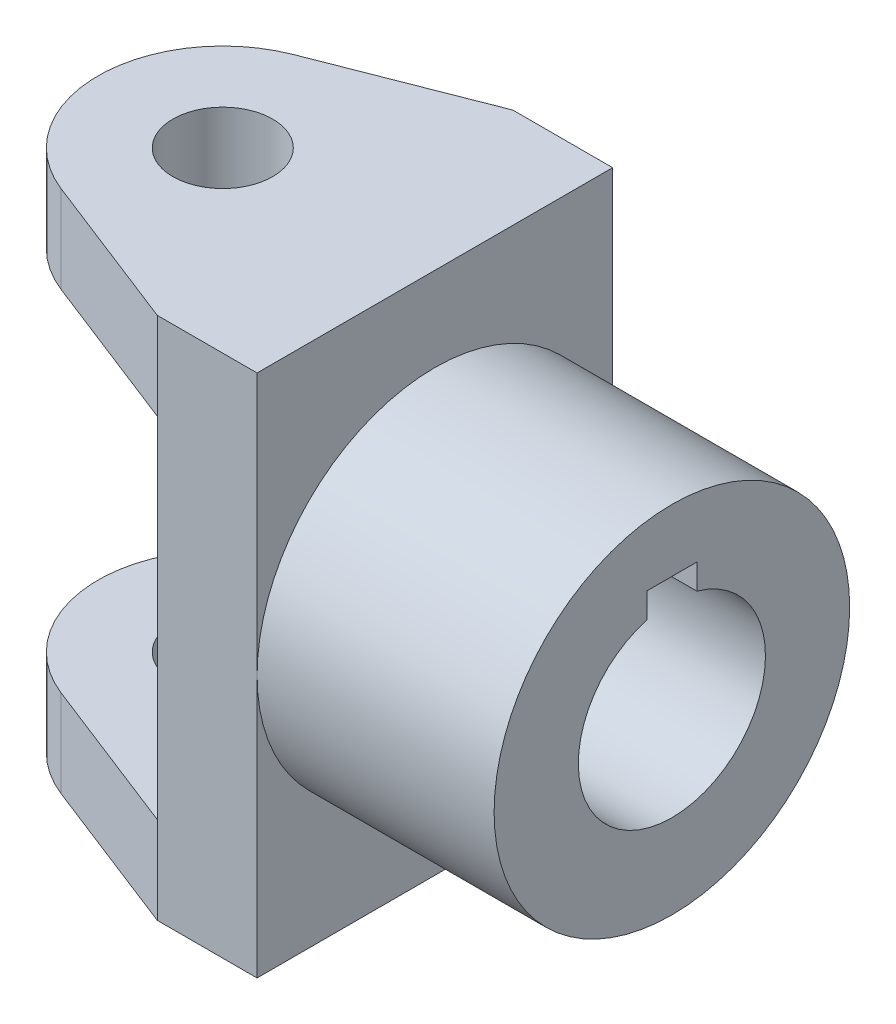
ISO-10303-21;
HEADER;
FILE_DESCRIPTION(('STEP AP214'),'2;1');
FILE_NAME('part.step','',(''),(''),'','','');
FILE_SCHEMA(('AUTOMOTIVE_DESIGN { 1 0 10303 214 1 1 1 1 }'));
ENDSEC;
DATA;
#1=APPLICATION_CONTEXT('core data for automotive mechanical design processes');
#2=APPLICATION_PROTOCOL_DEFINITION('international standard','automotive_design',2000,#1);
#3=PRODUCT_CONTEXT('',#1,'mechanical');
#4=PRODUCT('Part','Part','',(#3));
#5=PRODUCT_RELATED_PRODUCT_CATEGORY('part','',(#4));
#6=PRODUCT_DEFINITION_FORMATION('','',#4);
#7=PRODUCT_DEFINITION_CONTEXT('part definition',#1,'design');
#8=PRODUCT_DEFINITION('design','',#6,#7);
#9=PRODUCT_DEFINITION_SHAPE('','',#8);
#10=(LENGTH_UNIT() NAMED_UNIT(*) SI_UNIT(.MILLI.,.METRE.));
#11=(NAMED_UNIT(*) PLANE_ANGLE_UNIT() SI_UNIT($,.RADIAN.));
#12=(NAMED_UNIT(*) SI_UNIT($,.STERADIAN.) SOLID_ANGLE_UNIT());
#13=UNCERTAINTY_MEASURE_WITH_UNIT(LENGTH_MEASURE(1.E-05),#10,'distance_accuracy_value','');
#14=(GEOMETRIC_REPRESENTATION_CONTEXT(3) GLOBAL_UNCERTAINTY_ASSIGNED_CONTEXT((#13)) GLOBAL_UNIT_ASSIGNED_CONTEXT((#10,
#11,#12)) REPRESENTATION_CONTEXT('',''));
#15=CARTESIAN_POINT('',(0.,0.,0.));
#16=DIRECTION('',(0.,0.,1.));
#17=DIRECTION('',(1.,0.,0.));
#18=AXIS2_PLACEMENT_3D('',#15,#16,#17);
#19=CARTESIAN_POINT('',(-34.,-110.505474233816,0.));
#20=DIRECTION('',(0.,1.,0.));
#21=DIRECTION('',(0.,0.,1.));
#22=AXIS2_PLACEMENT_3D('',#19,#20,#21);
#23=CYLINDRICAL_SURFACE('',#22,8.);
#24=CARTESIAN_POINT('',(-34.,-42.,0.));
#25=DIRECTION('',(0.,1.,0.));
#26=DIRECTION('',(0.,0.,1.));
#27=AXIS2_PLACEMENT_3D('',#24,#25,#26);
#28=CIRCLE('',#27,8.);
#29=CARTESIAN_POINT('',(-34.,-42.,8.00000000000002));
#30=VERTEX_POINT('',#29);
#31=EDGE_CURVE('E223',#30,#30,#28,.F.);
#32=ORIENTED_EDGE('',*,*,#31,.T.);
#33=EDGE_LOOP('',(#32));
#34=FACE_BOUND('',#33,.T.);
#35=CARTESIAN_POINT('',(-34.,-28.,0.));
#36=DIRECTION('',(0.,1.,0.));
#37=DIRECTION('',(0.,0.,1.));
#38=AXIS2_PLACEMENT_3D('',#35,#36,#37);
#39=CIRCLE('',#38,8.);
#40=CARTESIAN_POINT('',(-34.,-28.,8.00000000000001));
#41=VERTEX_POINT('',#40);
#42=EDGE_CURVE('E211',#41,#41,#39,.F.);
#43=ORIENTED_EDGE('',*,*,#42,.F.);
#44=EDGE_LOOP('',(#43));
#45=FACE_BOUND('',#44,.T.);
#46=ADVANCED_FACE('F50',(#34,#45),#23,.F.);
#47=CARTESIAN_POINT('',(-11.773913756626,-110.505474233816,-30.150316819408));
#48=DIRECTION('',(-0.363755267255677,0.,-0.931494554757971));
#49=DIRECTION('',(-0.931494554757971,0.,0.363755267255677));
#50=AXIS2_PLACEMENT_3D('',#47,#48,#49);
#51=PLANE('',#50);
#52=DIRECTION('',(0.,1.,0.));
#53=VECTOR('',#52,1.);
#54=CARTESIAN_POINT('',(-41.2751053451135,-110.505474233816,-18.6298910951594));
#55=LINE('',#54,#53);
#56=CARTESIAN_POINT('',(-41.2751053451135,-42.,-18.6298910951594));
#57=VERTEX_POINT('',#56);
#58=CARTESIAN_POINT('',(-41.2751053451135,-28.,-18.6298910951594));
#59=VERTEX_POINT('',#58);
#60=EDGE_CURVE('E243',#57,#59,#55,.T.);
#61=ORIENTED_EDGE('',*,*,#60,.T.);
#62=DIRECTION('',(-0.931494554757971,0.,0.363755267255677));
#63=VECTOR('',#62,1.);
#64=CARTESIAN_POINT('',(-11.773913756626,-28.,-30.150316819408));
#65=LINE('',#64,#63);
#66=CARTESIAN_POINT('',(-16.,-28.,-28.5));
#67=VERTEX_POINT('',#66);
#68=EDGE_CURVE('E185',#67,#59,#65,.T.);
#69=ORIENTED_EDGE('',*,*,#68,.F.);
#70=DIRECTION('',(0.,-1.,0.));
#71=VECTOR('',#70,1.);
#72=CARTESIAN_POINT('',(-16.,-42.,-28.5));
#73=LINE('',#72,#71);
#74=CARTESIAN_POINT('',(-16.,-42.,-28.5));
#75=VERTEX_POINT('',#74);
#76=EDGE_CURVE('E252',#67,#75,#73,.T.);
#77=ORIENTED_EDGE('',*,*,#76,.T.);
#78=DIRECTION('',(0.931494554757971,0.,-0.363755267255677));
#79=VECTOR('',#78,1.);
#80=CARTESIAN_POINT('',(-11.773913756626,-42.,-30.150316819408));
#81=LINE('',#80,#79);
#82=EDGE_CURVE('E215',#57,#75,#81,.T.);
#83=ORIENTED_EDGE('',*,*,#82,.F.);
#84=EDGE_LOOP('',(#61,#69,#77,#83));
#85=FACE_BOUND('',#84,.T.);
#86=ADVANCED_FACE('F310',(#85),#51,.T.);
#87=CARTESIAN_POINT('',(-34.,-110.505474233816,0.));
#88=DIRECTION('',(0.,1.,0.));
#89=DIRECTION('',(0.,0.,1.));
#90=AXIS2_PLACEMENT_3D('',#87,#88,#89);
#91=CYLINDRICAL_SURFACE('',#90,20.);
#92=DIRECTION('',(0.,1.,0.));
#93=VECTOR('',#92,1.);
#94=CARTESIAN_POINT('',(-41.2751053451135,-110.505474233816,18.6298910951595));
#95=LINE('',#94,#93);
#96=CARTESIAN_POINT('',(-41.2751053451135,-42.,18.6298910951594));
#97=VERTEX_POINT('',#96);
#98=CARTESIAN_POINT('',(-41.2751053451135,-28.,18.6298910951594));
#99=VERTEX_POINT('',#98);
#100=EDGE_CURVE('E219',#97,#99,#95,.T.);
#101=ORIENTED_EDGE('',*,*,#100,.T.);
#102=CARTESIAN_POINT('',(-34.,-28.,0.));
#103=DIRECTION('',(0.,1.,0.));
#104=DIRECTION('',(0.,0.,1.));
#105=AXIS2_PLACEMENT_3D('',#102,#103,#104);
#106=CIRCLE('',#105,20.);
#107=EDGE_CURVE('E187',#59,#99,#106,.T.);
#108=ORIENTED_EDGE('',*,*,#107,.F.);
#109=ORIENTED_EDGE('',*,*,#60,.F.);
#110=CARTESIAN_POINT('',(-34.,-42.,0.));
#111=DIRECTION('',(0.,1.,0.));
#112=DIRECTION('',(0.,0.,1.));
#113=AXIS2_PLACEMENT_3D('',#110,#111,#112);
#114=CIRCLE('',#113,20.);
#115=EDGE_CURVE('E218',#97,#57,#114,.F.);
#116=ORIENTED_EDGE('',*,*,#115,.F.);
#117=EDGE_LOOP('',(#101,#108,#109,#116));
#118=FACE_BOUND('',#117,.T.);
#119=ADVANCED_FACE('F317',(#118),#91,.T.);
#120=CARTESIAN_POINT('',(-11.773913756626,-110.505474233816,30.150316819408));
#121=DIRECTION('',(-0.363755267255677,0.,0.931494554757971));
#122=DIRECTION('',(0.931494554757971,0.,0.363755267255677));
#123=AXIS2_PLACEMENT_3D('',#120,#121,#122);
#124=PLANE('',#123);
#125=DIRECTION('',(0.,1.,0.));
#126=VECTOR('',#125,1.);
#127=CARTESIAN_POINT('',(-16.,-42.,28.5));
#128=LINE('',#127,#126);
#129=CARTESIAN_POINT('',(-16.,-42.,28.5));
#130=VERTEX_POINT('',#129);
#131=CARTESIAN_POINT('',(-16.,-28.,28.5));
#132=VERTEX_POINT('',#131);
#133=EDGE_CURVE('E253',#130,#132,#128,.T.);
#134=ORIENTED_EDGE('',*,*,#133,.T.);
#135=DIRECTION('',(0.931494554757971,0.,0.363755267255677));
#136=VECTOR('',#135,1.);
#137=CARTESIAN_POINT('',(-11.773913756626,-28.,30.150316819408));
#138=LINE('',#137,#136);
#139=EDGE_CURVE('E189',#99,#132,#138,.T.);
#140=ORIENTED_EDGE('',*,*,#139,.F.);
#141=ORIENTED_EDGE('',*,*,#100,.F.);
#142=DIRECTION('',(-0.931494554757971,0.,-0.363755267255677));
#143=VECTOR('',#142,1.);
#144=CARTESIAN_POINT('',(-11.773913756626,-42.,30.150316819408));
#145=LINE('',#144,#143);
#146=EDGE_CURVE('E221',#130,#97,#145,.T.);
#147=ORIENTED_EDGE('',*,*,#146,.F.);
#148=EDGE_LOOP('',(#134,#140,#141,#147));
#149=FACE_BOUND('',#148,.T.);
#150=ADVANCED_FACE('F358',(#149),#124,.T.);
#151=CARTESIAN_POINT('',(38.,0.,0.));
#152=DIRECTION('',(1.,0.,0.));
#153=DIRECTION('',(0.,0.,-1.));
#154=AXIS2_PLACEMENT_3D('',#151,#152,#153);
#155=PLANE('',#154);
#156=DIRECTION('',(0.,1.,0.));
#157=VECTOR('',#156,1.);
#158=CARTESIAN_POINT('',(38.,18.5,-4.));
#159=LINE('',#158,#157);
#160=CARTESIAN_POINT('',(38.,14.456832294801,-4.));
#161=VERTEX_POINT('',#160);
#162=CARTESIAN_POINT('',(38.,18.5,-4.));
#163=VERTEX_POINT('',#162);
#164=EDGE_CURVE('E156',#161,#163,#159,.T.);
#165=ORIENTED_EDGE('',*,*,#164,.F.);
#166=CARTESIAN_POINT('',(38.,0.,0.));
#167=DIRECTION('',(1.,0.,0.));
#168=DIRECTION('',(0.,0.,-1.));
#169=AXIS2_PLACEMENT_3D('',#166,#167,#168);
#170=CIRCLE('',#169,15.);
#171=CARTESIAN_POINT('',(38.,14.456832294801,4.));
#172=VERTEX_POINT('',#171);
#173=EDGE_CURVE('E278',#172,#161,#170,.T.);
#174=ORIENTED_EDGE('',*,*,#173,.F.);
#175=DIRECTION('',(0.,-1.,0.));
#176=VECTOR('',#175,1.);
#177=CARTESIAN_POINT('',(38.,18.5,4.));
#178=LINE('',#177,#176);
#179=CARTESIAN_POINT('',(38.,18.5,4.));
#180=VERTEX_POINT('',#179);
#181=EDGE_CURVE('E173',#180,#172,#178,.T.);
#182=ORIENTED_EDGE('',*,*,#181,.F.);
#183=DIRECTION('',(0.,0.,1.));
#184=VECTOR('',#183,1.);
#185=CARTESIAN_POINT('',(38.,18.5,4.));
#186=LINE('',#185,#184);
#187=EDGE_CURVE('E167',#163,#180,#186,.T.);
#188=ORIENTED_EDGE('',*,*,#187,.F.);
#189=EDGE_LOOP('',(#165,#174,#182,#188));
#190=FACE_BOUND('',#189,.T.);
#191=CARTESIAN_POINT('',(38.,0.,0.));
#192=DIRECTION('',(1.,0.,0.));
#193=DIRECTION('',(0.,0.,-1.));
#194=AXIS2_PLACEMENT_3D('',#191,#192,#193);
#195=CIRCLE('',#194,28.5);
#196=CARTESIAN_POINT('',(38.,0.,-28.5));
#197=VERTEX_POINT('',#196);
#198=EDGE_CURVE('E281',#197,#197,#195,.T.);
#199=ORIENTED_EDGE('',*,*,#198,.T.);
#200=EDGE_LOOP('',(#199));
#201=FACE_BOUND('',#200,.T.);
#202=ADVANCED_FACE('F175',(#190,#201),#155,.T.);
#203=CARTESIAN_POINT('',(38.,0.,0.));
#204=DIRECTION('',(-1.,0.,0.));
#205=DIRECTION('',(0.,0.,1.));
#206=AXIS2_PLACEMENT_3D('',#203,#204,#205);
#207=CYLINDRICAL_SURFACE('',#206,28.5);
#208=ORIENTED_EDGE('',*,*,#198,.F.);
#209=EDGE_LOOP('',(#208));
#210=FACE_BOUND('',#209,.T.);
#211=CARTESIAN_POINT('',(0.,0.,0.));
#212=DIRECTION('',(1.,0.,0.));
#213=DIRECTION('',(0.,0.,-1.));
#214=AXIS2_PLACEMENT_3D('',#211,#212,#213);
#215=CIRCLE('',#214,28.5);
#216=CARTESIAN_POINT('',(0.,0.,-28.5));
#217=VERTEX_POINT('',#216);
#218=CARTESIAN_POINT('',(0.,0.,28.5));
#219=VERTEX_POINT('',#218);
#220=EDGE_CURVE('E284',#217,#219,#215,.T.);
#221=ORIENTED_EDGE('',*,*,#220,.T.);
#222=EDGE_CURVE('E280',#219,#217,#215,.T.);
#223=ORIENTED_EDGE('',*,*,#222,.T.);
#224=EDGE_LOOP('',(#221,#223));
#225=FACE_BOUND('',#224,.T.);
#226=ADVANCED_FACE('F52',(#210,#225),#207,.T.);
#227=CARTESIAN_POINT('',(38.,0.,0.));
#228=DIRECTION('',(-1.,0.,0.));
#229=DIRECTION('',(0.,0.,1.));
#230=AXIS2_PLACEMENT_3D('',#227,#228,#229);
#231=CYLINDRICAL_SURFACE('',#230,15.);
#232=DIRECTION('',(-1.,0.,0.));
#233=VECTOR('',#232,1.);
#234=CARTESIAN_POINT('',(38.,14.456832294801,-4.));
#235=LINE('',#234,#233);
#236=CARTESIAN_POINT('',(-16.,14.456832294801,-4.));
#237=VERTEX_POINT('',#236);
#238=EDGE_CURVE('E162',#237,#161,#235,.F.);
#239=ORIENTED_EDGE('',*,*,#238,.F.);
#240=CARTESIAN_POINT('',(-16.,0.,0.));
#241=DIRECTION('',(-1.,0.,0.));
#242=DIRECTION('',(0.,0.,1.));
#243=AXIS2_PLACEMENT_3D('',#240,#241,#242);
#244=CIRCLE('',#243,15.);
#245=CARTESIAN_POINT('',(-16.,14.456832294801,4.));
#246=VERTEX_POINT('',#245);
#247=EDGE_CURVE('E214',#237,#246,#244,.T.);
#248=ORIENTED_EDGE('',*,*,#247,.T.);
#249=DIRECTION('',(-1.,0.,0.));
#250=VECTOR('',#249,1.);
#251=CARTESIAN_POINT('',(38.,14.456832294801,4.));
#252=LINE('',#251,#250);
#253=EDGE_CURVE('E180',#172,#246,#252,.T.);
#254=ORIENTED_EDGE('',*,*,#253,.F.);
#255=ORIENTED_EDGE('',*,*,#173,.T.);
#256=EDGE_LOOP('',(#239,#248,#254,#255));
#257=FACE_BOUND('',#256,.T.);
#258=ADVANCED_FACE('F296',(#257),#231,.F.);
#259=CARTESIAN_POINT('',(0.,0.,0.));
#260=DIRECTION('',(-1.,0.,0.));
#261=DIRECTION('',(0.,0.,1.));
#262=AXIS2_PLACEMENT_3D('',#259,#260,#261);
#263=PLANE('',#262);
#264=ORIENTED_EDGE('',*,*,#220,.F.);
#265=DIRECTION('',(0.,-1.,0.));
#266=VECTOR('',#265,1.);
#267=CARTESIAN_POINT('',(0.,-42.,-28.5));
#268=LINE('',#267,#266);
#269=CARTESIAN_POINT('',(0.,42.,-28.5));
#270=VERTEX_POINT('',#269);
#271=EDGE_CURVE('E257',#270,#217,#268,.T.);
#272=ORIENTED_EDGE('',*,*,#271,.F.);
#273=DIRECTION('',(0.,0.,-1.));
#274=VECTOR('',#273,1.);
#275=CARTESIAN_POINT('',(0.,42.,28.5));
#276=LINE('',#275,#274);
#277=CARTESIAN_POINT('',(0.,42.,28.5));
#278=VERTEX_POINT('',#277);
#279=EDGE_CURVE('E265',#278,#270,#276,.T.);
#280=ORIENTED_EDGE('',*,*,#279,.F.);
#281=DIRECTION('',(0.,1.,0.));
#282=VECTOR('',#281,1.);
#283=CARTESIAN_POINT('',(0.,-42.,28.5));
#284=LINE('',#283,#282);
#285=EDGE_CURVE('E261',#219,#278,#284,.T.);
#286=ORIENTED_EDGE('',*,*,#285,.F.);
#287=EDGE_LOOP('',(#264,#272,#280,#286));
#288=FACE_BOUND('',#287,.T.);
#289=ADVANCED_FACE('F298',(#288),#263,.F.);
#290=ORIENTED_EDGE('',*,*,#222,.F.);
#291=CARTESIAN_POINT('',(0.,-42.,28.5));
#292=VERTEX_POINT('',#291);
#293=EDGE_CURVE('E262',#292,#219,#284,.T.);
#294=ORIENTED_EDGE('',*,*,#293,.F.);
#295=DIRECTION('',(0.,0.,1.));
#296=VECTOR('',#295,1.);
#297=CARTESIAN_POINT('',(0.,-42.,28.5));
#298=LINE('',#297,#296);
#299=CARTESIAN_POINT('',(0.,-42.,-28.5));
#300=VERTEX_POINT('',#299);
#301=EDGE_CURVE('E259',#300,#292,#298,.T.);
#302=ORIENTED_EDGE('',*,*,#301,.F.);
#303=EDGE_CURVE('E226',#217,#300,#268,.T.);
#304=ORIENTED_EDGE('',*,*,#303,.F.);
#305=EDGE_LOOP('',(#290,#294,#302,#304));
#306=FACE_BOUND('',#305,.T.);
#307=ADVANCED_FACE('F304',(#306),#263,.F.);
#308=CARTESIAN_POINT('',(-16.,-42.,-28.5));
#309=DIRECTION('',(0.,0.,1.));
#310=DIRECTION('',(1.,0.,0.));
#311=AXIS2_PLACEMENT_3D('',#308,#309,#310);
#312=PLANE('',#311);
#313=ORIENTED_EDGE('',*,*,#271,.T.);
#314=ORIENTED_EDGE('',*,*,#303,.T.);
#315=DIRECTION('',(1.,0.,0.));
#316=VECTOR('',#315,1.);
#317=CARTESIAN_POINT('',(-16.,-42.,-28.5));
#318=LINE('',#317,#316);
#319=EDGE_CURVE('E275',#75,#300,#318,.T.);
#320=ORIENTED_EDGE('',*,*,#319,.F.);
#321=ORIENTED_EDGE('',*,*,#76,.F.);
#322=DIRECTION('',(0.,1.,0.));
#323=VECTOR('',#322,1.);
#324=CARTESIAN_POINT('',(-16.,-28.,-28.5));
#325=LINE('',#324,#323);
#326=CARTESIAN_POINT('',(-16.,28.,-28.5));
#327=VERTEX_POINT('',#326);
#328=EDGE_CURVE('E204',#67,#327,#325,.T.);
#329=ORIENTED_EDGE('',*,*,#328,.T.);
#330=CARTESIAN_POINT('',(-16.,42.,-28.5));
#331=VERTEX_POINT('',#330);
#332=EDGE_CURVE('E248',#331,#327,#73,.T.);
#333=ORIENTED_EDGE('',*,*,#332,.F.);
#334=DIRECTION('',(1.,0.,0.));
#335=VECTOR('',#334,1.);
#336=CARTESIAN_POINT('',(-16.,42.,-28.5));
#337=LINE('',#336,#335);
#338=EDGE_CURVE('E256',#331,#270,#337,.T.);
#339=ORIENTED_EDGE('',*,*,#338,.T.);
#340=EDGE_LOOP('',(#313,#314,#320,#321,#329,#333,#339));
#341=FACE_BOUND('',#340,.T.);
#342=ADVANCED_FACE('F387',(#341),#312,.F.);
#343=CARTESIAN_POINT('',(-16.,-42.,28.5));
#344=DIRECTION('',(0.,1.,0.));
#345=DIRECTION('',(0.,0.,1.));
#346=AXIS2_PLACEMENT_3D('',#343,#344,#345);
#347=PLANE('',#346);
#348=ORIENTED_EDGE('',*,*,#301,.T.);
#349=DIRECTION('',(1.,0.,0.));
#350=VECTOR('',#349,1.);
#351=CARTESIAN_POINT('',(-16.,-42.,28.5));
#352=LINE('',#351,#350);
#353=EDGE_CURVE('E272',#130,#292,#352,.T.);
#354=ORIENTED_EDGE('',*,*,#353,.F.);
#355=ORIENTED_EDGE('',*,*,#146,.T.);
#356=ORIENTED_EDGE('',*,*,#115,.T.);
#357=ORIENTED_EDGE('',*,*,#82,.T.);
#358=ORIENTED_EDGE('',*,*,#319,.T.);
#359=EDGE_LOOP('',(#348,#354,#355,#356,#357,#358));
#360=FACE_BOUND('',#359,.T.);
#361=ORIENTED_EDGE('',*,*,#31,.F.);
#362=EDGE_LOOP('',(#361));
#363=FACE_BOUND('',#362,.T.);
#364=ADVANCED_FACE('F399',(#360,#363),#347,.F.);
#365=CARTESIAN_POINT('',(-16.,-42.,28.5));
#366=DIRECTION('',(0.,0.,-1.));
#367=DIRECTION('',(-1.,0.,0.));
#368=AXIS2_PLACEMENT_3D('',#365,#366,#367);
#369=PLANE('',#368);
#370=ORIENTED_EDGE('',*,*,#293,.T.);
#371=ORIENTED_EDGE('',*,*,#285,.T.);
#372=DIRECTION('',(1.,0.,0.));
#373=VECTOR('',#372,1.);
#374=CARTESIAN_POINT('',(-16.,42.,28.5));
#375=LINE('',#374,#373);
#376=CARTESIAN_POINT('',(-16.,42.,28.5));
#377=VERTEX_POINT('',#376);
#378=EDGE_CURVE('E269',#377,#278,#375,.T.);
#379=ORIENTED_EDGE('',*,*,#378,.F.);
#380=CARTESIAN_POINT('',(-16.,28.,28.5));
#381=VERTEX_POINT('',#380);
#382=EDGE_CURVE('E251',#381,#377,#128,.T.);
#383=ORIENTED_EDGE('',*,*,#382,.F.);
#384=DIRECTION('',(0.,1.,0.));
#385=VECTOR('',#384,1.);
#386=CARTESIAN_POINT('',(-16.,-28.,28.5));
#387=LINE('',#386,#385);
#388=EDGE_CURVE('E194',#132,#381,#387,.T.);
#389=ORIENTED_EDGE('',*,*,#388,.F.);
#390=ORIENTED_EDGE('',*,*,#133,.F.);
#391=ORIENTED_EDGE('',*,*,#353,.T.);
#392=EDGE_LOOP('',(#370,#371,#379,#383,#389,#390,#391));
#393=FACE_BOUND('',#392,.T.);
#394=ADVANCED_FACE('F332',(#393),#369,.F.);
#395=CARTESIAN_POINT('',(-16.,42.,28.5));
#396=DIRECTION('',(0.,-1.,0.));
#397=DIRECTION('',(0.,0.,-1.));
#398=AXIS2_PLACEMENT_3D('',#395,#396,#397);
#399=PLANE('',#398);
#400=ORIENTED_EDGE('',*,*,#279,.T.);
#401=ORIENTED_EDGE('',*,*,#338,.F.);
#402=DIRECTION('',(-0.931494554757971,0.,0.363755267255677));
#403=VECTOR('',#402,1.);
#404=CARTESIAN_POINT('',(-11.773913756626,42.,-30.150316819408));
#405=LINE('',#404,#403);
#406=CARTESIAN_POINT('',(-41.2751053451135,42.,-18.6298910951594));
#407=VERTEX_POINT('',#406);
#408=EDGE_CURVE('E233',#331,#407,#405,.T.);
#409=ORIENTED_EDGE('',*,*,#408,.T.);
#410=CARTESIAN_POINT('',(-34.,42.,0.));
#411=DIRECTION('',(0.,1.,0.));
#412=DIRECTION('',(0.,0.,1.));
#413=AXIS2_PLACEMENT_3D('',#410,#411,#412);
#414=CIRCLE('',#413,20.);
#415=CARTESIAN_POINT('',(-41.2751053451135,42.,18.6298910951594));
#416=VERTEX_POINT('',#415);
#417=EDGE_CURVE('E236',#407,#416,#414,.T.);
#418=ORIENTED_EDGE('',*,*,#417,.T.);
#419=DIRECTION('',(0.931494554757971,0.,0.363755267255677));
#420=VECTOR('',#419,1.);
#421=CARTESIAN_POINT('',(-11.773913756626,42.,30.150316819408));
#422=LINE('',#421,#420);
#423=EDGE_CURVE('E230',#416,#377,#422,.T.);
#424=ORIENTED_EDGE('',*,*,#423,.T.);
#425=ORIENTED_EDGE('',*,*,#378,.T.);
#426=EDGE_LOOP('',(#400,#401,#409,#418,#424,#425));
#427=FACE_BOUND('',#426,.T.);
#428=CARTESIAN_POINT('',(-34.,42.,0.));
#429=DIRECTION('',(0.,1.,0.));
#430=DIRECTION('',(0.,0.,1.));
#431=AXIS2_PLACEMENT_3D('',#428,#429,#430);
#432=CIRCLE('',#431,8.);
#433=CARTESIAN_POINT('',(-34.,42.,7.99999999999999));
#434=VERTEX_POINT('',#433);
#435=EDGE_CURVE('E227',#434,#434,#432,.T.);
#436=ORIENTED_EDGE('',*,*,#435,.F.);
#437=EDGE_LOOP('',(#436));
#438=FACE_BOUND('',#437,.T.);
#439=ADVANCED_FACE('F324',(#427,#438),#399,.F.);
#440=CARTESIAN_POINT('',(-34.,28.,0.));
#441=DIRECTION('',(0.,1.,0.));
#442=DIRECTION('',(0.,0.,1.));
#443=AXIS2_PLACEMENT_3D('',#440,#441,#442);
#444=CIRCLE('',#443,8.);
#445=CARTESIAN_POINT('',(-34.,28.,8.));
#446=VERTEX_POINT('',#445);
#447=EDGE_CURVE('E207',#446,#446,#444,.F.);
#448=ORIENTED_EDGE('',*,*,#447,.T.);
#449=EDGE_LOOP('',(#448));
#450=FACE_BOUND('',#449,.T.);
#451=ORIENTED_EDGE('',*,*,#435,.T.);
#452=EDGE_LOOP('',(#451));
#453=FACE_BOUND('',#452,.T.);
#454=ADVANCED_FACE('F313',(#450,#453),#23,.F.);
#455=DIRECTION('',(-0.931494554757971,0.,0.363755267255677));
#456=VECTOR('',#455,1.);
#457=CARTESIAN_POINT('',(-11.773913756626,28.,-30.150316819408));
#458=LINE('',#457,#456);
#459=CARTESIAN_POINT('',(-41.2751053451135,28.,-18.6298910951594));
#460=VERTEX_POINT('',#459);
#461=EDGE_CURVE('E184',#327,#460,#458,.T.);
#462=ORIENTED_EDGE('',*,*,#461,.T.);
#463=EDGE_CURVE('E239',#460,#407,#55,.T.);
#464=ORIENTED_EDGE('',*,*,#463,.T.);
#465=ORIENTED_EDGE('',*,*,#408,.F.);
#466=ORIENTED_EDGE('',*,*,#332,.T.);
#467=EDGE_LOOP('',(#462,#464,#465,#466));
#468=FACE_BOUND('',#467,.T.);
#469=ADVANCED_FACE('F320',(#468),#51,.T.);
#470=CARTESIAN_POINT('',(-34.,28.,0.));
#471=DIRECTION('',(0.,1.,0.));
#472=DIRECTION('',(0.,0.,1.));
#473=AXIS2_PLACEMENT_3D('',#470,#471,#472);
#474=CIRCLE('',#473,20.);
#475=CARTESIAN_POINT('',(-41.2751053451135,28.,18.6298910951594));
#476=VERTEX_POINT('',#475);
#477=EDGE_CURVE('E197',#460,#476,#474,.T.);
#478=ORIENTED_EDGE('',*,*,#477,.T.);
#479=EDGE_CURVE('E242',#476,#416,#95,.T.);
#480=ORIENTED_EDGE('',*,*,#479,.T.);
#481=ORIENTED_EDGE('',*,*,#417,.F.);
#482=ORIENTED_EDGE('',*,*,#463,.F.);
#483=EDGE_LOOP('',(#478,#480,#481,#482));
#484=FACE_BOUND('',#483,.T.);
#485=ADVANCED_FACE('F330',(#484),#91,.T.);
#486=DIRECTION('',(0.931494554757971,0.,0.363755267255677));
#487=VECTOR('',#486,1.);
#488=CARTESIAN_POINT('',(-11.773913756626,28.,30.150316819408));
#489=LINE('',#488,#487);
#490=EDGE_CURVE('E200',#476,#381,#489,.T.);
#491=ORIENTED_EDGE('',*,*,#490,.T.);
#492=ORIENTED_EDGE('',*,*,#382,.T.);
#493=ORIENTED_EDGE('',*,*,#423,.F.);
#494=ORIENTED_EDGE('',*,*,#479,.F.);
#495=EDGE_LOOP('',(#491,#492,#493,#494));
#496=FACE_BOUND('',#495,.T.);
#497=ADVANCED_FACE('F349',(#496),#124,.T.);
#498=CARTESIAN_POINT('',(0.,-28.,0.));
#499=DIRECTION('',(0.,1.,0.));
#500=DIRECTION('',(0.,0.,1.));
#501=AXIS2_PLACEMENT_3D('',#498,#499,#500);
#502=PLANE('',#501);
#503=ORIENTED_EDGE('',*,*,#68,.T.);
#504=ORIENTED_EDGE('',*,*,#107,.T.);
#505=ORIENTED_EDGE('',*,*,#139,.T.);
#506=DIRECTION('',(0.,0.,1.));
#507=VECTOR('',#506,1.);
#508=CARTESIAN_POINT('',(-16.,-28.,0.));
#509=LINE('',#508,#507);
#510=EDGE_CURVE('E192',#67,#132,#509,.T.);
#511=ORIENTED_EDGE('',*,*,#510,.F.);
#512=EDGE_LOOP('',(#503,#504,#505,#511));
#513=FACE_BOUND('',#512,.T.);
#514=ORIENTED_EDGE('',*,*,#42,.T.);
#515=EDGE_LOOP('',(#514));
#516=FACE_BOUND('',#515,.T.);
#517=ADVANCED_FACE('F342',(#513,#516),#502,.T.);
#518=CARTESIAN_POINT('',(0.,28.,0.));
#519=DIRECTION('',(0.,1.,0.));
#520=DIRECTION('',(0.,0.,1.));
#521=AXIS2_PLACEMENT_3D('',#518,#519,#520);
#522=PLANE('',#521);
#523=ORIENTED_EDGE('',*,*,#461,.F.);
#524=DIRECTION('',(0.,0.,1.));
#525=VECTOR('',#524,1.);
#526=CARTESIAN_POINT('',(-16.,28.,0.));
#527=LINE('',#526,#525);
#528=EDGE_CURVE('E73',#327,#381,#527,.T.);
#529=ORIENTED_EDGE('',*,*,#528,.T.);
#530=ORIENTED_EDGE('',*,*,#490,.F.);
#531=ORIENTED_EDGE('',*,*,#477,.F.);
#532=EDGE_LOOP('',(#523,#529,#530,#531));
#533=FACE_BOUND('',#532,.T.);
#534=ORIENTED_EDGE('',*,*,#447,.F.);
#535=EDGE_LOOP('',(#534));
#536=FACE_BOUND('',#535,.T.);
#537=ADVANCED_FACE('F340',(#533,#536),#522,.F.);
#538=CARTESIAN_POINT('',(-16.,-28.,0.));
#539=DIRECTION('',(-1.,0.,0.));
#540=DIRECTION('',(0.,0.,1.));
#541=AXIS2_PLACEMENT_3D('',#538,#539,#540);
#542=PLANE('',#541);
#543=DIRECTION('',(0.,-1.,0.));
#544=VECTOR('',#543,1.);
#545=CARTESIAN_POINT('',(-16.,-28.,-4.));
#546=LINE('',#545,#544);
#547=CARTESIAN_POINT('',(-16.,18.5,-4.));
#548=VERTEX_POINT('',#547);
#549=EDGE_CURVE('E13',#548,#237,#546,.T.);
#550=ORIENTED_EDGE('',*,*,#549,.F.);
#551=DIRECTION('',(0.,0.,-1.));
#552=VECTOR('',#551,1.);
#553=CARTESIAN_POINT('',(-16.,18.5,0.));
#554=LINE('',#553,#552);
#555=CARTESIAN_POINT('',(-16.,18.5,4.));
#556=VERTEX_POINT('',#555);
#557=EDGE_CURVE('E172',#556,#548,#554,.T.);
#558=ORIENTED_EDGE('',*,*,#557,.F.);
#559=DIRECTION('',(0.,1.,0.));
#560=VECTOR('',#559,1.);
#561=CARTESIAN_POINT('',(-16.,-28.,4.));
#562=LINE('',#561,#560);
#563=EDGE_CURVE('E58',#246,#556,#562,.T.);
#564=ORIENTED_EDGE('',*,*,#563,.F.);
#565=ORIENTED_EDGE('',*,*,#247,.F.);
#566=EDGE_LOOP('',(#550,#558,#564,#565));
#567=FACE_BOUND('',#566,.T.);
#568=ORIENTED_EDGE('',*,*,#528,.F.);
#569=ORIENTED_EDGE('',*,*,#328,.F.);
#570=ORIENTED_EDGE('',*,*,#510,.T.);
#571=ORIENTED_EDGE('',*,*,#388,.T.);
#572=EDGE_LOOP('',(#568,#569,#570,#571));
#573=FACE_BOUND('',#572,.T.);
#574=ADVANCED_FACE('F293',(#567,#573),#542,.T.);
#575=CARTESIAN_POINT('',(-54.,18.5,-4.));
#576=DIRECTION('',(0.,0.,-1.));
#577=DIRECTION('',(-1.,0.,0.));
#578=AXIS2_PLACEMENT_3D('',#575,#576,#577);
#579=PLANE('',#578);
#580=ORIENTED_EDGE('',*,*,#238,.T.);
#581=ORIENTED_EDGE('',*,*,#164,.T.);
#582=DIRECTION('',(1.,0.,0.));
#583=VECTOR('',#582,1.);
#584=CARTESIAN_POINT('',(-54.,18.5,-4.));
#585=LINE('',#584,#583);
#586=EDGE_CURVE('E159',#548,#163,#585,.T.);
#587=ORIENTED_EDGE('',*,*,#586,.F.);
#588=ORIENTED_EDGE('',*,*,#549,.T.);
#589=EDGE_LOOP('',(#580,#581,#587,#588));
#590=FACE_BOUND('',#589,.T.);
#591=ADVANCED_FACE('F158',(#590),#579,.F.);
#592=CARTESIAN_POINT('',(-54.,18.5,4.));
#593=DIRECTION('',(0.,0.,1.));
#594=DIRECTION('',(1.,0.,0.));
#595=AXIS2_PLACEMENT_3D('',#592,#593,#594);
#596=PLANE('',#595);
#597=ORIENTED_EDGE('',*,*,#253,.T.);
#598=ORIENTED_EDGE('',*,*,#563,.T.);
#599=DIRECTION('',(1.,0.,0.));
#600=VECTOR('',#599,1.);
#601=CARTESIAN_POINT('',(-54.,18.5,4.));
#602=LINE('',#601,#600);
#603=EDGE_CURVE('E65',#556,#180,#602,.T.);
#604=ORIENTED_EDGE('',*,*,#603,.T.);
#605=ORIENTED_EDGE('',*,*,#181,.T.);
#606=EDGE_LOOP('',(#597,#598,#604,#605));
#607=FACE_BOUND('',#606,.T.);
#608=ADVANCED_FACE('F289',(#607),#596,.F.);
#609=CARTESIAN_POINT('',(-54.,18.5,4.));
#610=DIRECTION('',(0.,1.,0.));
#611=DIRECTION('',(0.,0.,1.));
#612=AXIS2_PLACEMENT_3D('',#609,#610,#611);
#613=PLANE('',#612);
#614=ORIENTED_EDGE('',*,*,#557,.T.);
#615=ORIENTED_EDGE('',*,*,#586,.T.);
#616=ORIENTED_EDGE('',*,*,#187,.T.);
#617=ORIENTED_EDGE('',*,*,#603,.F.);
#618=EDGE_LOOP('',(#614,#615,#616,#617));
#619=FACE_BOUND('',#618,.T.);
#620=ADVANCED_FACE('F169',(#619),#613,.F.);
#621=CLOSED_SHELL('',(#46,#86,#119,#150,#202,#226,#258,#289,#307,#342,#364,#394,#439,#454,#469,
#485,#497,#517,#537,#574,#591,#608,#620));
#622=MANIFOLD_SOLID_BREP('B2',#621);
#623=ADVANCED_BREP_SHAPE_REPRESENTATION('',(#18,#622),#14);
#624=SHAPE_DEFINITION_REPRESENTATION(#9,#623);
ENDSEC;
END-ISO-10303-21;
